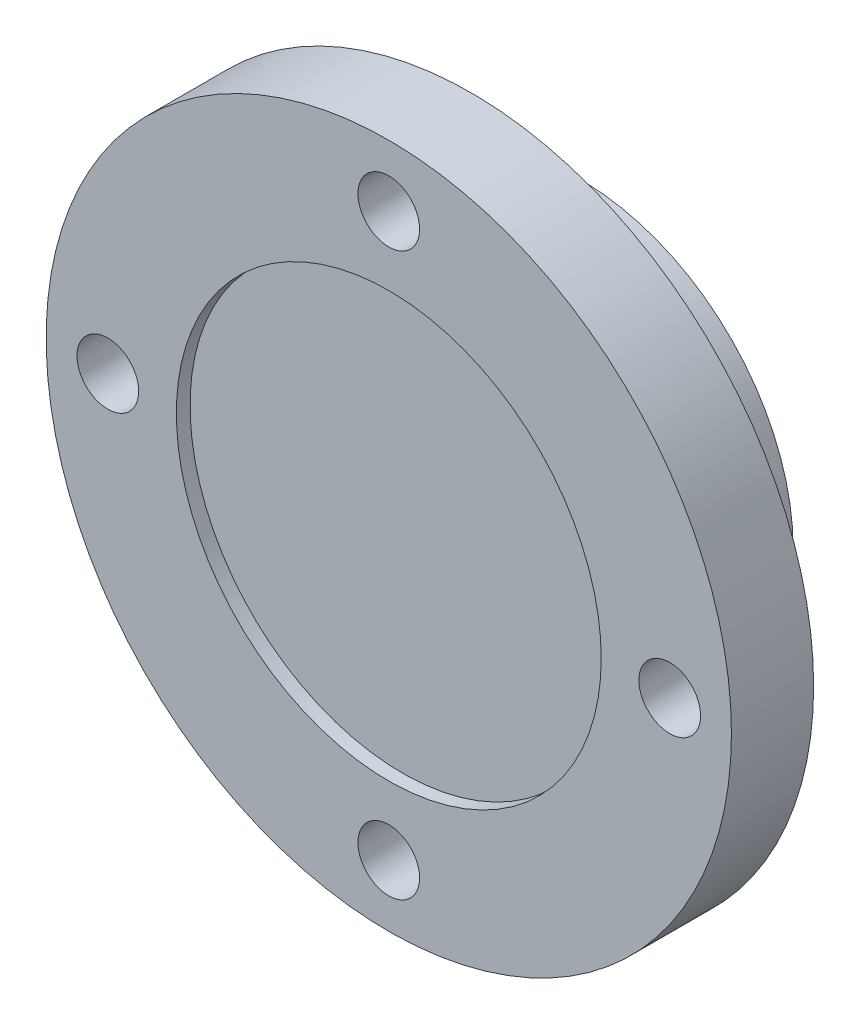
ISO-10303-21;
HEADER;
FILE_DESCRIPTION(('STEP AP214'),'2;1');
FILE_NAME('part.step','',(''),(''),'','','');
FILE_SCHEMA(('AUTOMOTIVE_DESIGN { 1 0 10303 214 1 1 1 1 }'));
ENDSEC;
DATA;
#1=APPLICATION_CONTEXT('core data for automotive mechanical design processes');
#2=APPLICATION_PROTOCOL_DEFINITION('international standard','automotive_design',2000,#1);
#3=PRODUCT_CONTEXT('',#1,'mechanical');
#4=PRODUCT('Part','Part','',(#3));
#5=PRODUCT_RELATED_PRODUCT_CATEGORY('part','',(#4));
#6=PRODUCT_DEFINITION_FORMATION('','',#4);
#7=PRODUCT_DEFINITION_CONTEXT('part definition',#1,'design');
#8=PRODUCT_DEFINITION('design','',#6,#7);
#9=PRODUCT_DEFINITION_SHAPE('','',#8);
#10=(LENGTH_UNIT() NAMED_UNIT(*) SI_UNIT(.MILLI.,.METRE.));
#11=(NAMED_UNIT(*) PLANE_ANGLE_UNIT() SI_UNIT($,.RADIAN.));
#12=(NAMED_UNIT(*) SI_UNIT($,.STERADIAN.) SOLID_ANGLE_UNIT());
#13=UNCERTAINTY_MEASURE_WITH_UNIT(LENGTH_MEASURE(1.E-05),#10,'distance_accuracy_value','');
#14=(GEOMETRIC_REPRESENTATION_CONTEXT(3) GLOBAL_UNCERTAINTY_ASSIGNED_CONTEXT((#13)) GLOBAL_UNIT_ASSIGNED_CONTEXT((#10,
#11,#12)) REPRESENTATION_CONTEXT('',''));
#15=CARTESIAN_POINT('',(0.,0.,0.));
#16=DIRECTION('',(0.,0.,1.));
#17=DIRECTION('',(1.,0.,0.));
#18=AXIS2_PLACEMENT_3D('',#15,#16,#17);
#19=CARTESIAN_POINT('',(0.,0.,-14.));
#20=DIRECTION('',(0.,0.,1.));
#21=DIRECTION('',(1.,0.,0.));
#22=AXIS2_PLACEMENT_3D('',#19,#20,#21);
#23=TOROIDAL_SURFACE('',#22,20.4688711258507,4.);
#24=CARTESIAN_POINT('',(0.,0.,-9.99999999999999));
#25=DIRECTION('',(0.,0.,1.));
#26=DIRECTION('',(1.,0.,0.));
#27=AXIS2_PLACEMENT_3D('',#24,#25,#26);
#28=CIRCLE('',#27,20.4688711258507);
#29=CARTESIAN_POINT('',(20.4688711258507,0.,-9.99999999999999));
#30=VERTEX_POINT('',#29);
#31=EDGE_CURVE('E84',#30,#30,#28,.T.);
#32=ORIENTED_EDGE('',*,*,#31,.T.);
#33=EDGE_LOOP('',(#32));
#34=FACE_BOUND('',#33,.T.);
#35=CARTESIAN_POINT('',(0.,0.,-13.5038610616432));
#36=DIRECTION('',(0.,0.,1.));
#37=DIRECTION('',(1.,0.,0.));
#38=AXIS2_PLACEMENT_3D('',#35,#36,#37);
#39=CIRCLE('',#38,24.4379826327054);
#40=CARTESIAN_POINT('',(24.4379826327054,0.,-13.5038610616432));
#41=VERTEX_POINT('',#40);
#42=EDGE_CURVE('E10',#41,#41,#39,.T.);
#43=ORIENTED_EDGE('',*,*,#42,.F.);
#44=EDGE_LOOP('',(#43));
#45=FACE_BOUND('',#44,.T.);
#46=ADVANCED_FACE('F45',(#34,#45),#23,.F.);
#47=CARTESIAN_POINT('',(0.,0.,-13.5038610616432));
#48=DIRECTION('',(0.,0.,-1.));
#49=DIRECTION('',(-1.,0.,0.));
#50=AXIS2_PLACEMENT_3D('',#47,#48,#49);
#51=CONICAL_SURFACE('',#50,24.4379826327054,0.124354994546761);
#52=CARTESIAN_POINT('',(0.,0.,-26.));
#53=DIRECTION('',(0.,0.,1.));
#54=DIRECTION('',(1.,0.,0.));
#55=AXIS2_PLACEMENT_3D('',#52,#53,#54);
#56=CIRCLE('',#55,26.);
#57=CARTESIAN_POINT('',(26.,0.,-26.));
#58=VERTEX_POINT('',#57);
#59=EDGE_CURVE('E52',#58,#58,#56,.T.);
#60=ORIENTED_EDGE('',*,*,#59,.F.);
#61=EDGE_LOOP('',(#60));
#62=FACE_BOUND('',#61,.T.);
#63=ORIENTED_EDGE('',*,*,#42,.T.);
#64=EDGE_LOOP('',(#63));
#65=FACE_BOUND('',#64,.T.);
#66=ADVANCED_FACE('F154',(#62,#65),#51,.F.);
#67=CARTESIAN_POINT('',(0.,0.,-26.));
#68=DIRECTION('',(0.,0.,1.));
#69=DIRECTION('',(1.,0.,0.));
#70=AXIS2_PLACEMENT_3D('',#67,#68,#69);
#71=PLANE('',#70);
#72=CARTESIAN_POINT('',(0.,0.,-26.));
#73=DIRECTION('',(0.,0.,1.));
#74=DIRECTION('',(1.,0.,0.));
#75=AXIS2_PLACEMENT_3D('',#72,#73,#74);
#76=CIRCLE('',#75,31.);
#77=CARTESIAN_POINT('',(31.,0.,-26.));
#78=VERTEX_POINT('',#77);
#79=EDGE_CURVE('E57',#78,#78,#76,.T.);
#80=ORIENTED_EDGE('',*,*,#79,.F.);
#81=EDGE_LOOP('',(#80));
#82=FACE_BOUND('',#81,.T.);
#83=ORIENTED_EDGE('',*,*,#59,.T.);
#84=EDGE_LOOP('',(#83));
#85=FACE_BOUND('',#84,.T.);
#86=ADVANCED_FACE('F149',(#82,#85),#71,.F.);
#87=CARTESIAN_POINT('',(0.,0.,0.));
#88=DIRECTION('',(0.,0.,1.));
#89=DIRECTION('',(1.,0.,0.));
#90=AXIS2_PLACEMENT_3D('',#87,#88,#89);
#91=CYLINDRICAL_SURFACE('',#90,31.);
#92=CARTESIAN_POINT('',(0.,0.,-9.99999999999999));
#93=DIRECTION('',(0.,0.,1.));
#94=DIRECTION('',(1.,0.,0.));
#95=AXIS2_PLACEMENT_3D('',#92,#93,#94);
#96=CIRCLE('',#95,31.);
#97=CARTESIAN_POINT('',(31.,0.,-9.99999999999999));
#98=VERTEX_POINT('',#97);
#99=EDGE_CURVE('E62',#98,#98,#96,.T.);
#100=ORIENTED_EDGE('',*,*,#99,.F.);
#101=EDGE_LOOP('',(#100));
#102=FACE_BOUND('',#101,.T.);
#103=ORIENTED_EDGE('',*,*,#79,.T.);
#104=EDGE_LOOP('',(#103));
#105=FACE_BOUND('',#104,.T.);
#106=ADVANCED_FACE('F135',(#102,#105),#91,.T.);
#107=CARTESIAN_POINT('',(0.,0.,-9.99999999999999));
#108=DIRECTION('',(0.,0.,1.));
#109=DIRECTION('',(1.,0.,0.));
#110=AXIS2_PLACEMENT_3D('',#107,#108,#109);
#111=PLANE('',#110);
#112=CARTESIAN_POINT('',(-41.,0.,-9.99999999999999));
#113=DIRECTION('',(0.,0.,-1.));
#114=DIRECTION('',(-1.,0.,0.));
#115=AXIS2_PLACEMENT_3D('',#112,#113,#114);
#116=CIRCLE('',#115,4.5);
#117=CARTESIAN_POINT('',(-45.5,0.,-9.99999999999999));
#118=VERTEX_POINT('',#117);
#119=EDGE_CURVE('E113',#118,#118,#116,.T.);
#120=ORIENTED_EDGE('',*,*,#119,.F.);
#121=EDGE_LOOP('',(#120));
#122=FACE_BOUND('',#121,.T.);
#123=CARTESIAN_POINT('',(0.,-41.,-9.99999999999999));
#124=DIRECTION('',(0.,0.,-1.));
#125=DIRECTION('',(-1.,0.,0.));
#126=AXIS2_PLACEMENT_3D('',#123,#124,#125);
#127=CIRCLE('',#126,4.5);
#128=CARTESIAN_POINT('',(-4.50000000000001,-41.,-9.99999999999999));
#129=VERTEX_POINT('',#128);
#130=EDGE_CURVE('E109',#129,#129,#127,.T.);
#131=ORIENTED_EDGE('',*,*,#130,.F.);
#132=EDGE_LOOP('',(#131));
#133=FACE_BOUND('',#132,.T.);
#134=CARTESIAN_POINT('',(41.,0.,-9.99999999999999));
#135=DIRECTION('',(0.,0.,-1.));
#136=DIRECTION('',(-1.,0.,0.));
#137=AXIS2_PLACEMENT_3D('',#134,#135,#136);
#138=CIRCLE('',#137,4.5);
#139=CARTESIAN_POINT('',(36.5,0.,-9.99999999999999));
#140=VERTEX_POINT('',#139);
#141=EDGE_CURVE('E101',#140,#140,#138,.T.);
#142=ORIENTED_EDGE('',*,*,#141,.F.);
#143=EDGE_LOOP('',(#142));
#144=FACE_BOUND('',#143,.T.);
#145=CARTESIAN_POINT('',(0.,41.,-9.99999999999999));
#146=DIRECTION('',(0.,0.,-1.));
#147=DIRECTION('',(-1.,0.,0.));
#148=AXIS2_PLACEMENT_3D('',#145,#146,#147);
#149=CIRCLE('',#148,4.5);
#150=CARTESIAN_POINT('',(-4.5,41.,-9.99999999999999));
#151=VERTEX_POINT('',#150);
#152=EDGE_CURVE('E93',#151,#151,#149,.T.);
#153=ORIENTED_EDGE('',*,*,#152,.F.);
#154=EDGE_LOOP('',(#153));
#155=FACE_BOUND('',#154,.T.);
#156=CARTESIAN_POINT('',(0.,0.,-9.99999999999999));
#157=DIRECTION('',(0.,0.,1.));
#158=DIRECTION('',(1.,0.,0.));
#159=AXIS2_PLACEMENT_3D('',#156,#157,#158);
#160=CIRCLE('',#159,50.);
#161=CARTESIAN_POINT('',(50.,0.,-9.99999999999999));
#162=VERTEX_POINT('',#161);
#163=EDGE_CURVE('E68',#162,#162,#160,.T.);
#164=ORIENTED_EDGE('',*,*,#163,.F.);
#165=EDGE_LOOP('',(#164));
#166=FACE_BOUND('',#165,.T.);
#167=ORIENTED_EDGE('',*,*,#99,.T.);
#168=EDGE_LOOP('',(#167));
#169=FACE_BOUND('',#168,.T.);
#170=ADVANCED_FACE('F131',(#122,#133,#144,#155,#166,#169),#111,.F.);
#171=CARTESIAN_POINT('',(0.,0.,0.));
#172=DIRECTION('',(0.,0.,1.));
#173=DIRECTION('',(1.,0.,0.));
#174=AXIS2_PLACEMENT_3D('',#171,#172,#173);
#175=CYLINDRICAL_SURFACE('',#174,50.);
#176=ORIENTED_EDGE('',*,*,#163,.T.);
#177=EDGE_LOOP('',(#176));
#178=FACE_BOUND('',#177,.T.);
#179=CARTESIAN_POINT('',(0.,0.,2.));
#180=DIRECTION('',(0.,0.,1.));
#181=DIRECTION('',(1.,0.,0.));
#182=AXIS2_PLACEMENT_3D('',#179,#180,#181);
#183=CIRCLE('',#182,50.);
#184=CARTESIAN_POINT('',(50.,0.,2.));
#185=VERTEX_POINT('',#184);
#186=EDGE_CURVE('E72',#185,#185,#183,.T.);
#187=ORIENTED_EDGE('',*,*,#186,.F.);
#188=EDGE_LOOP('',(#187));
#189=FACE_BOUND('',#188,.T.);
#190=ADVANCED_FACE('F134',(#178,#189),#175,.T.);
#191=CARTESIAN_POINT('',(0.,0.,2.00000000000001));
#192=DIRECTION('',(0.,0.,-1.));
#193=DIRECTION('',(-1.,0.,0.));
#194=AXIS2_PLACEMENT_3D('',#191,#192,#193);
#195=PLANE('',#194);
#196=CARTESIAN_POINT('',(-41.,0.,2.00000000000001));
#197=DIRECTION('',(0.,0.,-1.));
#198=DIRECTION('',(-1.,0.,0.));
#199=AXIS2_PLACEMENT_3D('',#196,#197,#198);
#200=CIRCLE('',#199,4.5);
#201=CARTESIAN_POINT('',(-45.5,0.,2.00000000000001));
#202=VERTEX_POINT('',#201);
#203=EDGE_CURVE('E88',#202,#202,#200,.T.);
#204=ORIENTED_EDGE('',*,*,#203,.T.);
#205=EDGE_LOOP('',(#204));
#206=FACE_BOUND('',#205,.T.);
#207=CARTESIAN_POINT('',(0.,-41.,2.00000000000001));
#208=DIRECTION('',(0.,0.,-1.));
#209=DIRECTION('',(-1.,0.,0.));
#210=AXIS2_PLACEMENT_3D('',#207,#208,#209);
#211=CIRCLE('',#210,4.5);
#212=CARTESIAN_POINT('',(-4.50000000000001,-41.,2.00000000000001));
#213=VERTEX_POINT('',#212);
#214=EDGE_CURVE('E105',#213,#213,#211,.T.);
#215=ORIENTED_EDGE('',*,*,#214,.T.);
#216=EDGE_LOOP('',(#215));
#217=FACE_BOUND('',#216,.T.);
#218=CARTESIAN_POINT('',(41.,0.,2.00000000000001));
#219=DIRECTION('',(0.,0.,-1.));
#220=DIRECTION('',(-1.,0.,0.));
#221=AXIS2_PLACEMENT_3D('',#218,#219,#220);
#222=CIRCLE('',#221,4.5);
#223=CARTESIAN_POINT('',(36.5,0.,2.00000000000001));
#224=VERTEX_POINT('',#223);
#225=EDGE_CURVE('E97',#224,#224,#222,.T.);
#226=ORIENTED_EDGE('',*,*,#225,.T.);
#227=EDGE_LOOP('',(#226));
#228=FACE_BOUND('',#227,.T.);
#229=CARTESIAN_POINT('',(0.,41.,2.00000000000001));
#230=DIRECTION('',(0.,0.,-1.));
#231=DIRECTION('',(-1.,0.,0.));
#232=AXIS2_PLACEMENT_3D('',#229,#230,#231);
#233=CIRCLE('',#232,4.5);
#234=CARTESIAN_POINT('',(-4.5,41.,2.00000000000001));
#235=VERTEX_POINT('',#234);
#236=EDGE_CURVE('E89',#235,#235,#233,.T.);
#237=ORIENTED_EDGE('',*,*,#236,.T.);
#238=EDGE_LOOP('',(#237));
#239=FACE_BOUND('',#238,.T.);
#240=CARTESIAN_POINT('',(0.,0.,2.00000000000001));
#241=DIRECTION('',(0.,0.,1.));
#242=DIRECTION('',(1.,0.,0.));
#243=AXIS2_PLACEMENT_3D('',#240,#241,#242);
#244=CIRCLE('',#243,31.);
#245=CARTESIAN_POINT('',(31.,0.,2.00000000000001));
#246=VERTEX_POINT('',#245);
#247=EDGE_CURVE('E76',#246,#246,#244,.T.);
#248=ORIENTED_EDGE('',*,*,#247,.F.);
#249=EDGE_LOOP('',(#248));
#250=FACE_BOUND('',#249,.T.);
#251=ORIENTED_EDGE('',*,*,#186,.T.);
#252=EDGE_LOOP('',(#251));
#253=FACE_BOUND('',#252,.T.);
#254=ADVANCED_FACE('F121',(#206,#217,#228,#239,#250,#253),#195,.F.);
#255=CARTESIAN_POINT('',(0.,0.,0.));
#256=DIRECTION('',(0.,0.,1.));
#257=DIRECTION('',(1.,0.,0.));
#258=AXIS2_PLACEMENT_3D('',#255,#256,#257);
#259=CYLINDRICAL_SURFACE('',#258,31.);
#260=ORIENTED_EDGE('',*,*,#247,.T.);
#261=EDGE_LOOP('',(#260));
#262=FACE_BOUND('',#261,.T.);
#263=CARTESIAN_POINT('',(0.,0.,0.));
#264=DIRECTION('',(0.,0.,1.));
#265=DIRECTION('',(1.,0.,0.));
#266=AXIS2_PLACEMENT_3D('',#263,#264,#265);
#267=CIRCLE('',#266,31.);
#268=CARTESIAN_POINT('',(31.,0.,0.));
#269=VERTEX_POINT('',#268);
#270=EDGE_CURVE('E80',#269,#269,#267,.T.);
#271=ORIENTED_EDGE('',*,*,#270,.F.);
#272=EDGE_LOOP('',(#271));
#273=FACE_BOUND('',#272,.T.);
#274=ADVANCED_FACE('F179',(#262,#273),#259,.F.);
#275=CARTESIAN_POINT('',(0.,0.,0.));
#276=DIRECTION('',(0.,0.,-1.));
#277=DIRECTION('',(-1.,0.,0.));
#278=AXIS2_PLACEMENT_3D('',#275,#276,#277);
#279=PLANE('',#278);
#280=ORIENTED_EDGE('',*,*,#270,.T.);
#281=EDGE_LOOP('',(#280));
#282=FACE_BOUND('',#281,.T.);
#283=ADVANCED_FACE('F170',(#282),#279,.F.);
#284=CARTESIAN_POINT('',(0.,0.,-9.99999999999999));
#285=DIRECTION('',(0.,0.,-1.));
#286=DIRECTION('',(-1.,0.,0.));
#287=AXIS2_PLACEMENT_3D('',#284,#285,#286);
#288=PLANE('',#287);
#289=ORIENTED_EDGE('',*,*,#31,.F.);
#290=EDGE_LOOP('',(#289));
#291=FACE_BOUND('',#290,.T.);
#292=ADVANCED_FACE('F167',(#291),#288,.T.);
#293=CARTESIAN_POINT('',(0.,41.,2.00000000000001));
#294=DIRECTION('',(0.,0.,-1.));
#295=DIRECTION('',(-1.,0.,0.));
#296=AXIS2_PLACEMENT_3D('',#293,#294,#295);
#297=CYLINDRICAL_SURFACE('',#296,4.5);
#298=ORIENTED_EDGE('',*,*,#236,.F.);
#299=EDGE_LOOP('',(#298));
#300=FACE_BOUND('',#299,.T.);
#301=ORIENTED_EDGE('',*,*,#152,.T.);
#302=EDGE_LOOP('',(#301));
#303=FACE_BOUND('',#302,.T.);
#304=ADVANCED_FACE('F169',(#300,#303),#297,.F.);
#305=CARTESIAN_POINT('',(41.,0.,2.00000000000001));
#306=DIRECTION('',(0.,0.,-1.));
#307=DIRECTION('',(-1.,0.,0.));
#308=AXIS2_PLACEMENT_3D('',#305,#306,#307);
#309=CYLINDRICAL_SURFACE('',#308,4.5);
#310=ORIENTED_EDGE('',*,*,#225,.F.);
#311=EDGE_LOOP('',(#310));
#312=FACE_BOUND('',#311,.T.);
#313=ORIENTED_EDGE('',*,*,#141,.T.);
#314=EDGE_LOOP('',(#313));
#315=FACE_BOUND('',#314,.T.);
#316=ADVANCED_FACE('F176',(#312,#315),#309,.F.);
#317=CARTESIAN_POINT('',(0.,-41.,2.00000000000001));
#318=DIRECTION('',(0.,0.,-1.));
#319=DIRECTION('',(-1.,0.,0.));
#320=AXIS2_PLACEMENT_3D('',#317,#318,#319);
#321=CYLINDRICAL_SURFACE('',#320,4.5);
#322=ORIENTED_EDGE('',*,*,#214,.F.);
#323=EDGE_LOOP('',(#322));
#324=FACE_BOUND('',#323,.T.);
#325=ORIENTED_EDGE('',*,*,#130,.T.);
#326=EDGE_LOOP('',(#325));
#327=FACE_BOUND('',#326,.T.);
#328=ADVANCED_FACE('F127',(#324,#327),#321,.F.);
#329=CARTESIAN_POINT('',(-41.,0.,2.00000000000001));
#330=DIRECTION('',(0.,0.,-1.));
#331=DIRECTION('',(-1.,0.,0.));
#332=AXIS2_PLACEMENT_3D('',#329,#330,#331);
#333=CYLINDRICAL_SURFACE('',#332,4.5);
#334=ORIENTED_EDGE('',*,*,#203,.F.);
#335=EDGE_LOOP('',(#334));
#336=FACE_BOUND('',#335,.T.);
#337=ORIENTED_EDGE('',*,*,#119,.T.);
#338=EDGE_LOOP('',(#337));
#339=FACE_BOUND('',#338,.T.);
#340=ADVANCED_FACE('F124',(#336,#339),#333,.F.);
#341=CLOSED_SHELL('',(#46,#66,#86,#106,#170,#190,#254,#274,#283,#292,#304,#316,#328,#340));
#342=MANIFOLD_SOLID_BREP('B2',#341);
#343=ADVANCED_BREP_SHAPE_REPRESENTATION('',(#18,#342),#14);
#344=SHAPE_DEFINITION_REPRESENTATION(#9,#343);
ENDSEC;
END-ISO-10303-21;
